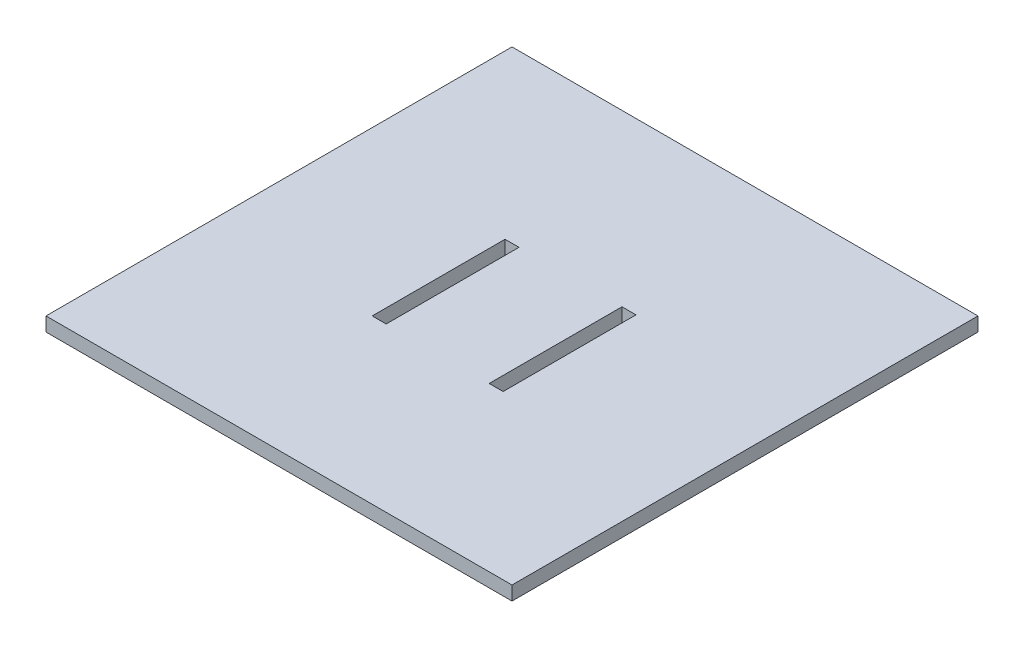
ISO-10303-21;
HEADER;
FILE_DESCRIPTION(('STEP AP214'),'2;1');
FILE_NAME('part.step','',(''),(''),'','','');
FILE_SCHEMA(('AUTOMOTIVE_DESIGN { 1 0 10303 214 1 1 1 1 }'));
ENDSEC;
DATA;
#1=APPLICATION_CONTEXT('core data for automotive mechanical design processes');
#2=APPLICATION_PROTOCOL_DEFINITION('international standard','automotive_design',2000,#1);
#3=PRODUCT_CONTEXT('',#1,'mechanical');
#4=PRODUCT('Part','Part','',(#3));
#5=PRODUCT_RELATED_PRODUCT_CATEGORY('part','',(#4));
#6=PRODUCT_DEFINITION_FORMATION('','',#4);
#7=PRODUCT_DEFINITION_CONTEXT('part definition',#1,'design');
#8=PRODUCT_DEFINITION('design','',#6,#7);
#9=PRODUCT_DEFINITION_SHAPE('','',#8);
#10=(LENGTH_UNIT() NAMED_UNIT(*) SI_UNIT(.MILLI.,.METRE.));
#11=(NAMED_UNIT(*) PLANE_ANGLE_UNIT() SI_UNIT($,.RADIAN.));
#12=(NAMED_UNIT(*) SI_UNIT($,.STERADIAN.) SOLID_ANGLE_UNIT());
#13=UNCERTAINTY_MEASURE_WITH_UNIT(LENGTH_MEASURE(1.E-05),#10,'distance_accuracy_value','');
#14=(GEOMETRIC_REPRESENTATION_CONTEXT(3) GLOBAL_UNCERTAINTY_ASSIGNED_CONTEXT((#13)) GLOBAL_UNIT_ASSIGNED_CONTEXT((#10,
#11,#12)) REPRESENTATION_CONTEXT('',''));
#15=CARTESIAN_POINT('',(0.,0.,0.));
#16=DIRECTION('',(0.,0.,1.));
#17=DIRECTION('',(1.,0.,0.));
#18=AXIS2_PLACEMENT_3D('',#15,#16,#17);
#19=CARTESIAN_POINT('',(0.,3.,0.));
#20=DIRECTION('',(0.,-1.,0.));
#21=DIRECTION('',(0.,0.,-1.));
#22=AXIS2_PLACEMENT_3D('',#19,#20,#21);
#23=PLANE('',#22);
#24=DIRECTION('',(0.,0.,1.));
#25=VECTOR('',#24,1.);
#26=CARTESIAN_POINT('',(35.,3.,-63.5));
#27=LINE('',#26,#25);
#28=CARTESIAN_POINT('',(35.,3.,-63.5));
#29=VERTEX_POINT('',#28);
#30=CARTESIAN_POINT('',(35.,3.,-35.));
#31=VERTEX_POINT('',#30);
#32=EDGE_CURVE('E158',#29,#31,#27,.T.);
#33=ORIENTED_EDGE('',*,*,#32,.F.);
#34=DIRECTION('',(-1.,0.,0.));
#35=VECTOR('',#34,1.);
#36=CARTESIAN_POINT('',(35.,3.,-63.5));
#37=LINE('',#36,#35);
#38=CARTESIAN_POINT('',(38.,3.,-63.5));
#39=VERTEX_POINT('',#38);
#40=EDGE_CURVE('E166',#39,#29,#37,.T.);
#41=ORIENTED_EDGE('',*,*,#40,.F.);
#42=DIRECTION('',(0.,0.,-1.));
#43=VECTOR('',#42,1.);
#44=CARTESIAN_POINT('',(38.,3.,-63.5));
#45=LINE('',#44,#43);
#46=CARTESIAN_POINT('',(38.,3.,-35.));
#47=VERTEX_POINT('',#46);
#48=EDGE_CURVE('E163',#47,#39,#45,.T.);
#49=ORIENTED_EDGE('',*,*,#48,.F.);
#50=DIRECTION('',(1.,0.,0.));
#51=VECTOR('',#50,1.);
#52=CARTESIAN_POINT('',(35.,3.,-35.));
#53=LINE('',#52,#51);
#54=EDGE_CURVE('E160',#31,#47,#53,.T.);
#55=ORIENTED_EDGE('',*,*,#54,.F.);
#56=EDGE_LOOP('',(#33,#41,#49,#55));
#57=FACE_BOUND('',#56,.T.);
#58=DIRECTION('',(0.,0.,1.));
#59=VECTOR('',#58,1.);
#60=CARTESIAN_POINT('',(0.,3.,0.));
#61=LINE('',#60,#59);
#62=CARTESIAN_POINT('',(0.,3.,-100.));
#63=VERTEX_POINT('',#62);
#64=CARTESIAN_POINT('',(0.,3.,0.));
#65=VERTEX_POINT('',#64);
#66=EDGE_CURVE('E189',#63,#65,#61,.T.);
#67=ORIENTED_EDGE('',*,*,#66,.T.);
#68=DIRECTION('',(1.,0.,0.));
#69=VECTOR('',#68,1.);
#70=CARTESIAN_POINT('',(0.,3.,0.));
#71=LINE('',#70,#69);
#72=CARTESIAN_POINT('',(100.,3.,0.));
#73=VERTEX_POINT('',#72);
#74=EDGE_CURVE('E192',#65,#73,#71,.T.);
#75=ORIENTED_EDGE('',*,*,#74,.T.);
#76=DIRECTION('',(0.,0.,-1.));
#77=VECTOR('',#76,1.);
#78=CARTESIAN_POINT('',(100.,3.,0.));
#79=LINE('',#78,#77);
#80=CARTESIAN_POINT('',(100.,3.,-100.));
#81=VERTEX_POINT('',#80);
#82=EDGE_CURVE('E195',#73,#81,#79,.T.);
#83=ORIENTED_EDGE('',*,*,#82,.T.);
#84=DIRECTION('',(-1.,0.,0.));
#85=VECTOR('',#84,1.);
#86=CARTESIAN_POINT('',(0.,3.,-100.));
#87=LINE('',#86,#85);
#88=EDGE_CURVE('E197',#81,#63,#87,.T.);
#89=ORIENTED_EDGE('',*,*,#88,.T.);
#90=EDGE_LOOP('',(#67,#75,#83,#89));
#91=FACE_BOUND('',#90,.T.);
#92=DIRECTION('',(0.,0.,1.));
#93=VECTOR('',#92,1.);
#94=CARTESIAN_POINT('',(60.1,3.,-63.5));
#95=LINE('',#94,#93);
#96=CARTESIAN_POINT('',(60.1,3.,-63.5));
#97=VERTEX_POINT('',#96);
#98=CARTESIAN_POINT('',(60.1,3.,-35.));
#99=VERTEX_POINT('',#98);
#100=EDGE_CURVE('E122',#97,#99,#95,.T.);
#101=ORIENTED_EDGE('',*,*,#100,.F.);
#102=DIRECTION('',(-1.,0.,0.));
#103=VECTOR('',#102,1.);
#104=CARTESIAN_POINT('',(60.1,3.,-63.5));
#105=LINE('',#104,#103);
#106=CARTESIAN_POINT('',(63.1,3.,-63.5));
#107=VERTEX_POINT('',#106);
#108=EDGE_CURVE('E144',#107,#97,#105,.T.);
#109=ORIENTED_EDGE('',*,*,#108,.F.);
#110=DIRECTION('',(0.,0.,-1.));
#111=VECTOR('',#110,1.);
#112=CARTESIAN_POINT('',(63.1,3.,-63.5));
#113=LINE('',#112,#111);
#114=CARTESIAN_POINT('',(63.1,3.,-35.));
#115=VERTEX_POINT('',#114);
#116=EDGE_CURVE('E142',#115,#107,#113,.T.);
#117=ORIENTED_EDGE('',*,*,#116,.F.);
#118=DIRECTION('',(1.,0.,0.));
#119=VECTOR('',#118,1.);
#120=CARTESIAN_POINT('',(60.1,3.,-35.));
#121=LINE('',#120,#119);
#122=EDGE_CURVE('E130',#99,#115,#121,.T.);
#123=ORIENTED_EDGE('',*,*,#122,.F.);
#124=EDGE_LOOP('',(#101,#109,#117,#123));
#125=FACE_BOUND('',#124,.T.);
#126=ADVANCED_FACE('F33',(#57,#91,#125),#23,.F.);
#127=CARTESIAN_POINT('',(0.,0.,0.));
#128=DIRECTION('',(0.,-1.,0.));
#129=DIRECTION('',(0.,0.,-1.));
#130=AXIS2_PLACEMENT_3D('',#127,#128,#129);
#131=PLANE('',#130);
#132=DIRECTION('',(0.,0.,1.));
#133=VECTOR('',#132,1.);
#134=CARTESIAN_POINT('',(0.,0.,0.));
#135=LINE('',#134,#133);
#136=CARTESIAN_POINT('',(0.,0.,-100.));
#137=VERTEX_POINT('',#136);
#138=CARTESIAN_POINT('',(0.,0.,0.));
#139=VERTEX_POINT('',#138);
#140=EDGE_CURVE('E188',#137,#139,#135,.T.);
#141=ORIENTED_EDGE('',*,*,#140,.F.);
#142=DIRECTION('',(-1.,0.,0.));
#143=VECTOR('',#142,1.);
#144=CARTESIAN_POINT('',(0.,0.,-100.));
#145=LINE('',#144,#143);
#146=CARTESIAN_POINT('',(100.,0.,-100.));
#147=VERTEX_POINT('',#146);
#148=EDGE_CURVE('E193',#147,#137,#145,.T.);
#149=ORIENTED_EDGE('',*,*,#148,.F.);
#150=DIRECTION('',(0.,0.,-1.));
#151=VECTOR('',#150,1.);
#152=CARTESIAN_POINT('',(100.,0.,0.));
#153=LINE('',#152,#151);
#154=CARTESIAN_POINT('',(100.,0.,0.));
#155=VERTEX_POINT('',#154);
#156=EDGE_CURVE('E204',#155,#147,#153,.T.);
#157=ORIENTED_EDGE('',*,*,#156,.F.);
#158=DIRECTION('',(1.,0.,0.));
#159=VECTOR('',#158,1.);
#160=CARTESIAN_POINT('',(0.,0.,0.));
#161=LINE('',#160,#159);
#162=EDGE_CURVE('E202',#139,#155,#161,.T.);
#163=ORIENTED_EDGE('',*,*,#162,.F.);
#164=EDGE_LOOP('',(#141,#149,#157,#163));
#165=FACE_BOUND('',#164,.T.);
#166=DIRECTION('',(-1.,0.,0.));
#167=VECTOR('',#166,1.);
#168=CARTESIAN_POINT('',(35.,0.,-63.5));
#169=LINE('',#168,#167);
#170=CARTESIAN_POINT('',(38.,0.,-63.5));
#171=VERTEX_POINT('',#170);
#172=CARTESIAN_POINT('',(35.,0.,-63.5));
#173=VERTEX_POINT('',#172);
#174=EDGE_CURVE('E161',#171,#173,#169,.T.);
#175=ORIENTED_EDGE('',*,*,#174,.T.);
#176=DIRECTION('',(0.,0.,1.));
#177=VECTOR('',#176,1.);
#178=CARTESIAN_POINT('',(35.,0.,-63.5));
#179=LINE('',#178,#177);
#180=CARTESIAN_POINT('',(35.,0.,-35.));
#181=VERTEX_POINT('',#180);
#182=EDGE_CURVE('E138',#173,#181,#179,.T.);
#183=ORIENTED_EDGE('',*,*,#182,.T.);
#184=DIRECTION('',(1.,0.,0.));
#185=VECTOR('',#184,1.);
#186=CARTESIAN_POINT('',(35.,0.,-35.));
#187=LINE('',#186,#185);
#188=CARTESIAN_POINT('',(38.,0.,-35.));
#189=VERTEX_POINT('',#188);
#190=EDGE_CURVE('E171',#181,#189,#187,.T.);
#191=ORIENTED_EDGE('',*,*,#190,.T.);
#192=DIRECTION('',(0.,0.,-1.));
#193=VECTOR('',#192,1.);
#194=CARTESIAN_POINT('',(38.,0.,-63.5));
#195=LINE('',#194,#193);
#196=EDGE_CURVE('E174',#189,#171,#195,.T.);
#197=ORIENTED_EDGE('',*,*,#196,.T.);
#198=EDGE_LOOP('',(#175,#183,#191,#197));
#199=FACE_BOUND('',#198,.T.);
#200=DIRECTION('',(-1.,0.,0.));
#201=VECTOR('',#200,1.);
#202=CARTESIAN_POINT('',(60.1,0.,-63.5));
#203=LINE('',#202,#201);
#204=CARTESIAN_POINT('',(63.1,0.,-63.5));
#205=VERTEX_POINT('',#204);
#206=CARTESIAN_POINT('',(60.1,0.,-63.5));
#207=VERTEX_POINT('',#206);
#208=EDGE_CURVE('E131',#205,#207,#203,.T.);
#209=ORIENTED_EDGE('',*,*,#208,.T.);
#210=DIRECTION('',(0.,0.,1.));
#211=VECTOR('',#210,1.);
#212=CARTESIAN_POINT('',(60.1,0.,-63.5));
#213=LINE('',#212,#211);
#214=CARTESIAN_POINT('',(60.1,0.,-35.));
#215=VERTEX_POINT('',#214);
#216=EDGE_CURVE('E56',#207,#215,#213,.T.);
#217=ORIENTED_EDGE('',*,*,#216,.T.);
#218=DIRECTION('',(1.,0.,0.));
#219=VECTOR('',#218,1.);
#220=CARTESIAN_POINT('',(60.1,0.,-35.));
#221=LINE('',#220,#219);
#222=CARTESIAN_POINT('',(63.1,0.,-35.));
#223=VERTEX_POINT('',#222);
#224=EDGE_CURVE('E137',#215,#223,#221,.T.);
#225=ORIENTED_EDGE('',*,*,#224,.T.);
#226=DIRECTION('',(0.,0.,-1.));
#227=VECTOR('',#226,1.);
#228=CARTESIAN_POINT('',(63.1,0.,-63.5));
#229=LINE('',#228,#227);
#230=EDGE_CURVE('E150',#223,#205,#229,.T.);
#231=ORIENTED_EDGE('',*,*,#230,.T.);
#232=EDGE_LOOP('',(#209,#217,#225,#231));
#233=FACE_BOUND('',#232,.T.);
#234=ADVANCED_FACE('F222',(#165,#199,#233),#131,.T.);
#235=CARTESIAN_POINT('',(0.,3.,0.));
#236=DIRECTION('',(1.,0.,0.));
#237=DIRECTION('',(0.,0.,-1.));
#238=AXIS2_PLACEMENT_3D('',#235,#236,#237);
#239=PLANE('',#238);
#240=ORIENTED_EDGE('',*,*,#140,.T.);
#241=DIRECTION('',(0.,-1.,0.));
#242=VECTOR('',#241,1.);
#243=CARTESIAN_POINT('',(0.,3.,0.));
#244=LINE('',#243,#242);
#245=EDGE_CURVE('E11',#65,#139,#244,.T.);
#246=ORIENTED_EDGE('',*,*,#245,.F.);
#247=ORIENTED_EDGE('',*,*,#66,.F.);
#248=DIRECTION('',(0.,-1.,0.));
#249=VECTOR('',#248,1.);
#250=CARTESIAN_POINT('',(0.,3.,-100.));
#251=LINE('',#250,#249);
#252=EDGE_CURVE('E199',#63,#137,#251,.T.);
#253=ORIENTED_EDGE('',*,*,#252,.T.);
#254=EDGE_LOOP('',(#240,#246,#247,#253));
#255=FACE_BOUND('',#254,.T.);
#256=ADVANCED_FACE('F35',(#255),#239,.F.);
#257=CARTESIAN_POINT('',(0.,3.,0.));
#258=DIRECTION('',(0.,0.,-1.));
#259=DIRECTION('',(-1.,0.,0.));
#260=AXIS2_PLACEMENT_3D('',#257,#258,#259);
#261=PLANE('',#260);
#262=ORIENTED_EDGE('',*,*,#162,.T.);
#263=DIRECTION('',(0.,-1.,0.));
#264=VECTOR('',#263,1.);
#265=CARTESIAN_POINT('',(100.,3.,0.));
#266=LINE('',#265,#264);
#267=EDGE_CURVE('E41',#73,#155,#266,.T.);
#268=ORIENTED_EDGE('',*,*,#267,.F.);
#269=ORIENTED_EDGE('',*,*,#74,.F.);
#270=ORIENTED_EDGE('',*,*,#245,.T.);
#271=EDGE_LOOP('',(#262,#268,#269,#270));
#272=FACE_BOUND('',#271,.T.);
#273=ADVANCED_FACE('F232',(#272),#261,.F.);
#274=CARTESIAN_POINT('',(100.,3.,0.));
#275=DIRECTION('',(-1.,0.,0.));
#276=DIRECTION('',(0.,0.,1.));
#277=AXIS2_PLACEMENT_3D('',#274,#275,#276);
#278=PLANE('',#277);
#279=ORIENTED_EDGE('',*,*,#156,.T.);
#280=DIRECTION('',(0.,-1.,0.));
#281=VECTOR('',#280,1.);
#282=CARTESIAN_POINT('',(100.,3.,-100.));
#283=LINE('',#282,#281);
#284=EDGE_CURVE('E209',#81,#147,#283,.T.);
#285=ORIENTED_EDGE('',*,*,#284,.F.);
#286=ORIENTED_EDGE('',*,*,#82,.F.);
#287=ORIENTED_EDGE('',*,*,#267,.T.);
#288=EDGE_LOOP('',(#279,#285,#286,#287));
#289=FACE_BOUND('',#288,.T.);
#290=ADVANCED_FACE('F216',(#289),#278,.F.);
#291=CARTESIAN_POINT('',(0.,3.,-100.));
#292=DIRECTION('',(0.,0.,1.));
#293=DIRECTION('',(1.,0.,0.));
#294=AXIS2_PLACEMENT_3D('',#291,#292,#293);
#295=PLANE('',#294);
#296=ORIENTED_EDGE('',*,*,#148,.T.);
#297=ORIENTED_EDGE('',*,*,#252,.F.);
#298=ORIENTED_EDGE('',*,*,#88,.F.);
#299=ORIENTED_EDGE('',*,*,#284,.T.);
#300=EDGE_LOOP('',(#296,#297,#298,#299));
#301=FACE_BOUND('',#300,.T.);
#302=ADVANCED_FACE('F226',(#301),#295,.F.);
#303=CARTESIAN_POINT('',(35.,3.,-63.5));
#304=DIRECTION('',(1.,0.,0.));
#305=DIRECTION('',(0.,0.,-1.));
#306=AXIS2_PLACEMENT_3D('',#303,#304,#305);
#307=PLANE('',#306);
#308=ORIENTED_EDGE('',*,*,#182,.F.);
#309=DIRECTION('',(0.,-1.,0.));
#310=VECTOR('',#309,1.);
#311=CARTESIAN_POINT('',(35.,3.,-63.5));
#312=LINE('',#311,#310);
#313=EDGE_CURVE('E168',#29,#173,#312,.T.);
#314=ORIENTED_EDGE('',*,*,#313,.F.);
#315=ORIENTED_EDGE('',*,*,#32,.T.);
#316=DIRECTION('',(0.,-1.,0.));
#317=VECTOR('',#316,1.);
#318=CARTESIAN_POINT('',(35.,3.,-35.));
#319=LINE('',#318,#317);
#320=EDGE_CURVE('E185',#31,#181,#319,.T.);
#321=ORIENTED_EDGE('',*,*,#320,.T.);
#322=EDGE_LOOP('',(#308,#314,#315,#321));
#323=FACE_BOUND('',#322,.T.);
#324=ADVANCED_FACE('F248',(#323),#307,.T.);
#325=CARTESIAN_POINT('',(35.,3.,-35.));
#326=DIRECTION('',(0.,0.,-1.));
#327=DIRECTION('',(-1.,0.,0.));
#328=AXIS2_PLACEMENT_3D('',#325,#326,#327);
#329=PLANE('',#328);
#330=ORIENTED_EDGE('',*,*,#190,.F.);
#331=ORIENTED_EDGE('',*,*,#320,.F.);
#332=ORIENTED_EDGE('',*,*,#54,.T.);
#333=DIRECTION('',(0.,-1.,0.));
#334=VECTOR('',#333,1.);
#335=CARTESIAN_POINT('',(38.,3.,-35.));
#336=LINE('',#335,#334);
#337=EDGE_CURVE('E183',#47,#189,#336,.T.);
#338=ORIENTED_EDGE('',*,*,#337,.T.);
#339=EDGE_LOOP('',(#330,#331,#332,#338));
#340=FACE_BOUND('',#339,.T.);
#341=ADVANCED_FACE('F255',(#340),#329,.T.);
#342=CARTESIAN_POINT('',(38.,3.,-63.5));
#343=DIRECTION('',(-1.,0.,0.));
#344=DIRECTION('',(0.,0.,1.));
#345=AXIS2_PLACEMENT_3D('',#342,#343,#344);
#346=PLANE('',#345);
#347=ORIENTED_EDGE('',*,*,#196,.F.);
#348=ORIENTED_EDGE('',*,*,#337,.F.);
#349=ORIENTED_EDGE('',*,*,#48,.T.);
#350=DIRECTION('',(0.,-1.,0.));
#351=VECTOR('',#350,1.);
#352=CARTESIAN_POINT('',(38.,3.,-63.5));
#353=LINE('',#352,#351);
#354=EDGE_CURVE('E181',#39,#171,#353,.T.);
#355=ORIENTED_EDGE('',*,*,#354,.T.);
#356=EDGE_LOOP('',(#347,#348,#349,#355));
#357=FACE_BOUND('',#356,.T.);
#358=ADVANCED_FACE('F260',(#357),#346,.T.);
#359=CARTESIAN_POINT('',(35.,3.,-63.5));
#360=DIRECTION('',(0.,0.,1.));
#361=DIRECTION('',(1.,0.,0.));
#362=AXIS2_PLACEMENT_3D('',#359,#360,#361);
#363=PLANE('',#362);
#364=ORIENTED_EDGE('',*,*,#174,.F.);
#365=ORIENTED_EDGE('',*,*,#354,.F.);
#366=ORIENTED_EDGE('',*,*,#40,.T.);
#367=ORIENTED_EDGE('',*,*,#313,.T.);
#368=EDGE_LOOP('',(#364,#365,#366,#367));
#369=FACE_BOUND('',#368,.T.);
#370=ADVANCED_FACE('F266',(#369),#363,.T.);
#371=CARTESIAN_POINT('',(60.1,3.,-63.5));
#372=DIRECTION('',(1.,0.,0.));
#373=DIRECTION('',(0.,0.,-1.));
#374=AXIS2_PLACEMENT_3D('',#371,#372,#373);
#375=PLANE('',#374);
#376=ORIENTED_EDGE('',*,*,#216,.F.);
#377=DIRECTION('',(0.,-1.,0.));
#378=VECTOR('',#377,1.);
#379=CARTESIAN_POINT('',(60.1,3.,-63.5));
#380=LINE('',#379,#378);
#381=EDGE_CURVE('E126',#97,#207,#380,.T.);
#382=ORIENTED_EDGE('',*,*,#381,.F.);
#383=ORIENTED_EDGE('',*,*,#100,.T.);
#384=DIRECTION('',(0.,-1.,0.));
#385=VECTOR('',#384,1.);
#386=CARTESIAN_POINT('',(60.1,3.,-35.));
#387=LINE('',#386,#385);
#388=EDGE_CURVE('E125',#99,#215,#387,.T.);
#389=ORIENTED_EDGE('',*,*,#388,.T.);
#390=EDGE_LOOP('',(#376,#382,#383,#389));
#391=FACE_BOUND('',#390,.T.);
#392=ADVANCED_FACE('F124',(#391),#375,.T.);
#393=CARTESIAN_POINT('',(60.1,3.,-35.));
#394=DIRECTION('',(0.,0.,-1.));
#395=DIRECTION('',(-1.,0.,0.));
#396=AXIS2_PLACEMENT_3D('',#393,#394,#395);
#397=PLANE('',#396);
#398=ORIENTED_EDGE('',*,*,#224,.F.);
#399=ORIENTED_EDGE('',*,*,#388,.F.);
#400=ORIENTED_EDGE('',*,*,#122,.T.);
#401=DIRECTION('',(0.,-1.,0.));
#402=VECTOR('',#401,1.);
#403=CARTESIAN_POINT('',(63.1,3.,-35.));
#404=LINE('',#403,#402);
#405=EDGE_CURVE('E139',#115,#223,#404,.T.);
#406=ORIENTED_EDGE('',*,*,#405,.T.);
#407=EDGE_LOOP('',(#398,#399,#400,#406));
#408=FACE_BOUND('',#407,.T.);
#409=ADVANCED_FACE('F134',(#408),#397,.T.);
#410=CARTESIAN_POINT('',(63.1,3.,-63.5));
#411=DIRECTION('',(-1.,0.,0.));
#412=DIRECTION('',(0.,0.,1.));
#413=AXIS2_PLACEMENT_3D('',#410,#411,#412);
#414=PLANE('',#413);
#415=ORIENTED_EDGE('',*,*,#230,.F.);
#416=ORIENTED_EDGE('',*,*,#405,.F.);
#417=ORIENTED_EDGE('',*,*,#116,.T.);
#418=DIRECTION('',(0.,-1.,0.));
#419=VECTOR('',#418,1.);
#420=CARTESIAN_POINT('',(63.1,3.,-63.5));
#421=LINE('',#420,#419);
#422=EDGE_CURVE('E48',#107,#205,#421,.T.);
#423=ORIENTED_EDGE('',*,*,#422,.T.);
#424=EDGE_LOOP('',(#415,#416,#417,#423));
#425=FACE_BOUND('',#424,.T.);
#426=ADVANCED_FACE('F285',(#425),#414,.T.);
#427=CARTESIAN_POINT('',(60.1,3.,-63.5));
#428=DIRECTION('',(0.,0.,1.));
#429=DIRECTION('',(1.,0.,0.));
#430=AXIS2_PLACEMENT_3D('',#427,#428,#429);
#431=PLANE('',#430);
#432=ORIENTED_EDGE('',*,*,#208,.F.);
#433=ORIENTED_EDGE('',*,*,#422,.F.);
#434=ORIENTED_EDGE('',*,*,#108,.T.);
#435=ORIENTED_EDGE('',*,*,#381,.T.);
#436=EDGE_LOOP('',(#432,#433,#434,#435));
#437=FACE_BOUND('',#436,.T.);
#438=ADVANCED_FACE('F288',(#437),#431,.T.);
#439=CLOSED_SHELL('',(#126,#234,#256,#273,#290,#302,#324,#341,#358,#370,#392,#409,#426,#438));
#440=MANIFOLD_SOLID_BREP('B2',#439);
#441=ADVANCED_BREP_SHAPE_REPRESENTATION('',(#18,#440),#14);
#442=SHAPE_DEFINITION_REPRESENTATION(#9,#441);
ENDSEC;
END-ISO-10303-21;
